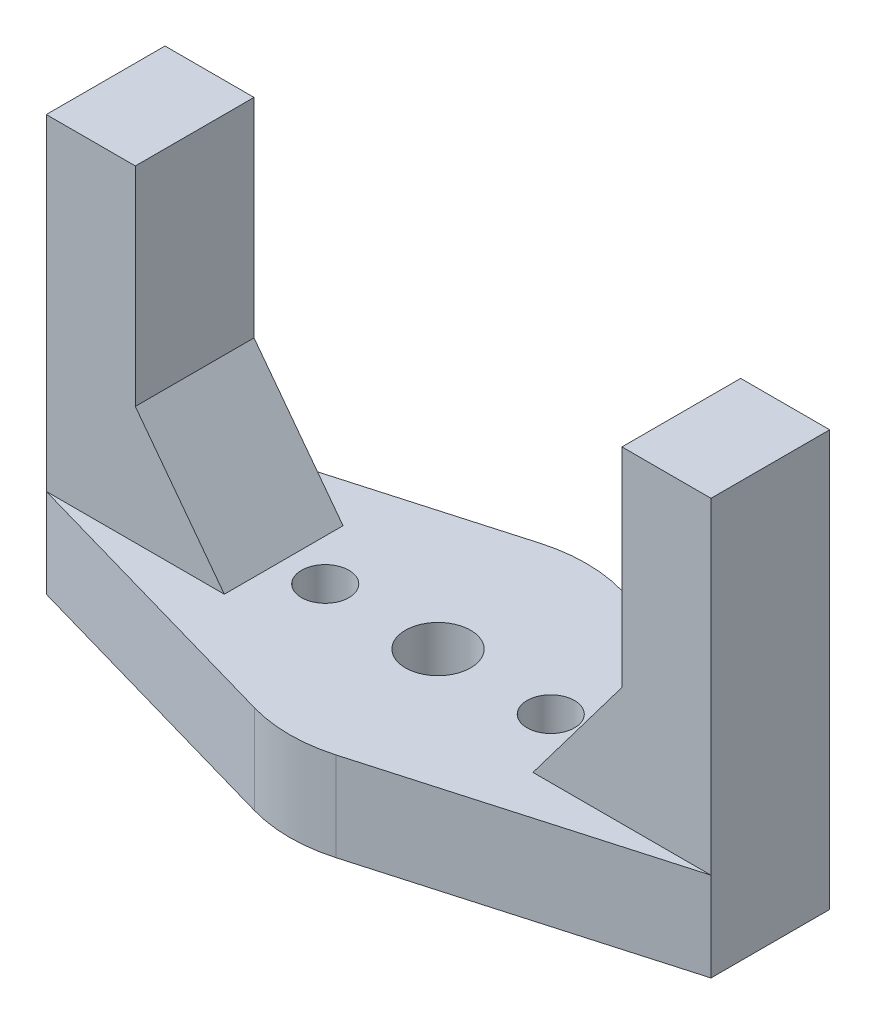
ISO-10303-21;
HEADER;
FILE_DESCRIPTION(('STEP AP214'),'2;1');
FILE_NAME('part.step','',(''),(''),'','','');
FILE_SCHEMA(('AUTOMOTIVE_DESIGN { 1 0 10303 214 1 1 1 1 }'));
ENDSEC;
DATA;
#1=APPLICATION_CONTEXT('core data for automotive mechanical design processes');
#2=APPLICATION_PROTOCOL_DEFINITION('international standard','automotive_design',2000,#1);
#3=PRODUCT_CONTEXT('',#1,'mechanical');
#4=PRODUCT('Part','Part','',(#3));
#5=PRODUCT_RELATED_PRODUCT_CATEGORY('part','',(#4));
#6=PRODUCT_DEFINITION_FORMATION('','',#4);
#7=PRODUCT_DEFINITION_CONTEXT('part definition',#1,'design');
#8=PRODUCT_DEFINITION('design','',#6,#7);
#9=PRODUCT_DEFINITION_SHAPE('','',#8);
#10=(LENGTH_UNIT() NAMED_UNIT(*) SI_UNIT(.MILLI.,.METRE.));
#11=(NAMED_UNIT(*) PLANE_ANGLE_UNIT() SI_UNIT($,.RADIAN.));
#12=(NAMED_UNIT(*) SI_UNIT($,.STERADIAN.) SOLID_ANGLE_UNIT());
#13=UNCERTAINTY_MEASURE_WITH_UNIT(LENGTH_MEASURE(1.E-05),#10,'distance_accuracy_value','');
#14=(GEOMETRIC_REPRESENTATION_CONTEXT(3) GLOBAL_UNCERTAINTY_ASSIGNED_CONTEXT((#13)) GLOBAL_UNIT_ASSIGNED_CONTEXT((#10,
#11,#12)) REPRESENTATION_CONTEXT('',''));
#15=CARTESIAN_POINT('',(0.,0.,0.));
#16=DIRECTION('',(0.,0.,1.));
#17=DIRECTION('',(1.,0.,0.));
#18=AXIS2_PLACEMENT_3D('',#15,#16,#17);
#19=CARTESIAN_POINT('',(0.,15.,0.));
#20=DIRECTION('',(0.,1.,0.));
#21=DIRECTION('',(0.,0.,1.));
#22=AXIS2_PLACEMENT_3D('',#19,#20,#21);
#23=PLANE('',#22);
#24=CARTESIAN_POINT('',(0.,15.,0.));
#25=DIRECTION('',(0.,1.,0.));
#26=DIRECTION('',(0.,0.,1.));
#27=AXIS2_PLACEMENT_3D('',#24,#25,#26);
#28=CIRCLE('',#27,5.5);
#29=CARTESIAN_POINT('',(0.,15.,5.5));
#30=VERTEX_POINT('',#29);
#31=EDGE_CURVE('E364',#30,#30,#28,.T.);
#32=ORIENTED_EDGE('',*,*,#31,.F.);
#33=EDGE_LOOP('',(#32));
#34=FACE_BOUND('',#33,.T.);
#35=CARTESIAN_POINT('',(19.,15.,0.));
#36=DIRECTION('',(0.,1.,0.));
#37=DIRECTION('',(0.,0.,1.));
#38=AXIS2_PLACEMENT_3D('',#35,#36,#37);
#39=CIRCLE('',#38,4.);
#40=CARTESIAN_POINT('',(19.,15.,3.99999999999999));
#41=VERTEX_POINT('',#40);
#42=EDGE_CURVE('E357',#41,#41,#39,.T.);
#43=ORIENTED_EDGE('',*,*,#42,.F.);
#44=EDGE_LOOP('',(#43));
#45=FACE_BOUND('',#44,.T.);
#46=CARTESIAN_POINT('',(-19.,15.,0.));
#47=DIRECTION('',(0.,1.,0.));
#48=DIRECTION('',(0.,0.,1.));
#49=AXIS2_PLACEMENT_3D('',#46,#47,#48);
#50=CIRCLE('',#49,4.);
#51=CARTESIAN_POINT('',(-19.,15.,4.));
#52=VERTEX_POINT('',#51);
#53=EDGE_CURVE('E353',#52,#52,#50,.T.);
#54=ORIENTED_EDGE('',*,*,#53,.F.);
#55=EDGE_LOOP('',(#54));
#56=FACE_BOUND('',#55,.T.);
#57=DIRECTION('',(-1.,0.,0.));
#58=VECTOR('',#57,1.);
#59=CARTESIAN_POINT('',(56.,15.,10.));
#60=LINE('',#59,#58);
#61=CARTESIAN_POINT('',(56.,15.,10.));
#62=VERTEX_POINT('',#61);
#63=CARTESIAN_POINT('',(26.0000000000001,15.,10.));
#64=VERTEX_POINT('',#63);
#65=EDGE_CURVE('E399',#62,#64,#60,.T.);
#66=ORIENTED_EDGE('',*,*,#65,.T.);
#67=DIRECTION('',(0.,0.,-1.));
#68=VECTOR('',#67,1.);
#69=CARTESIAN_POINT('',(26.0000000000001,15.,-10.));
#70=LINE('',#69,#68);
#71=CARTESIAN_POINT('',(26.0000000000001,15.,-10.));
#72=VERTEX_POINT('',#71);
#73=EDGE_CURVE('E410',#64,#72,#70,.T.);
#74=ORIENTED_EDGE('',*,*,#73,.T.);
#75=DIRECTION('',(1.,0.,0.));
#76=VECTOR('',#75,1.);
#77=CARTESIAN_POINT('',(56.,15.,-10.));
#78=LINE('',#77,#76);
#79=CARTESIAN_POINT('',(56.,15.,-10.));
#80=VERTEX_POINT('',#79);
#81=EDGE_CURVE('E282',#72,#80,#78,.T.);
#82=ORIENTED_EDGE('',*,*,#81,.T.);
#83=DIRECTION('',(0.961521918786539,0.,0.27472822878811));
#84=VECTOR('',#83,1.);
#85=CARTESIAN_POINT('',(6.86820571970274,15.,-24.0380479696634));
#86=LINE('',#85,#84);
#87=CARTESIAN_POINT('',(6.8682057197028,15.,-24.0380479696634));
#88=VERTEX_POINT('',#87);
#89=EDGE_CURVE('E271',#88,#80,#86,.T.);
#90=ORIENTED_EDGE('',*,*,#89,.F.);
#91=CARTESIAN_POINT('',(0.,15.,0.));
#92=DIRECTION('',(0.,1.,0.));
#93=DIRECTION('',(0.,0.,1.));
#94=AXIS2_PLACEMENT_3D('',#91,#92,#93);
#95=CIRCLE('',#94,25.);
#96=CARTESIAN_POINT('',(-6.86820571970296,15.,-24.0380479696634));
#97=VERTEX_POINT('',#96);
#98=EDGE_CURVE('E390',#88,#97,#95,.T.);
#99=ORIENTED_EDGE('',*,*,#98,.T.);
#100=DIRECTION('',(-0.961521918786537,0.,0.274728228788119));
#101=VECTOR('',#100,1.);
#102=CARTESIAN_POINT('',(-6.86820571970297,15.,-24.0380479696634));
#103=LINE('',#102,#101);
#104=CARTESIAN_POINT('',(-56.,15.,-10.));
#105=VERTEX_POINT('',#104);
#106=EDGE_CURVE('E395',#97,#105,#103,.T.);
#107=ORIENTED_EDGE('',*,*,#106,.T.);
#108=DIRECTION('',(1.,0.,0.));
#109=VECTOR('',#108,1.);
#110=CARTESIAN_POINT('',(-56.,15.,-10.));
#111=LINE('',#110,#109);
#112=CARTESIAN_POINT('',(-26.0000000000001,15.,-10.));
#113=VERTEX_POINT('',#112);
#114=EDGE_CURVE('E427',#105,#113,#111,.T.);
#115=ORIENTED_EDGE('',*,*,#114,.T.);
#116=DIRECTION('',(0.,0.,1.));
#117=VECTOR('',#116,1.);
#118=CARTESIAN_POINT('',(-26.0000000000001,15.,10.));
#119=LINE('',#118,#117);
#120=CARTESIAN_POINT('',(-26.0000000000001,15.,10.));
#121=VERTEX_POINT('',#120);
#122=EDGE_CURVE('E406',#113,#121,#119,.T.);
#123=ORIENTED_EDGE('',*,*,#122,.T.);
#124=DIRECTION('',(-1.,0.,0.));
#125=VECTOR('',#124,1.);
#126=CARTESIAN_POINT('',(-56.,15.,10.));
#127=LINE('',#126,#125);
#128=CARTESIAN_POINT('',(-56.,15.,10.));
#129=VERTEX_POINT('',#128);
#130=EDGE_CURVE('E381',#121,#129,#127,.T.);
#131=ORIENTED_EDGE('',*,*,#130,.T.);
#132=DIRECTION('',(-0.961521918786537,0.,-0.274728228788119));
#133=VECTOR('',#132,1.);
#134=CARTESIAN_POINT('',(-6.86820571970297,15.,24.0380479696634));
#135=LINE('',#134,#133);
#136=CARTESIAN_POINT('',(-6.86820571970296,15.,24.0380479696634));
#137=VERTEX_POINT('',#136);
#138=EDGE_CURVE('E452',#137,#129,#135,.T.);
#139=ORIENTED_EDGE('',*,*,#138,.F.);
#140=CARTESIAN_POINT('',(0.,15.,0.));
#141=DIRECTION('',(0.,1.,0.));
#142=DIRECTION('',(0.,0.,1.));
#143=AXIS2_PLACEMENT_3D('',#140,#141,#142);
#144=CIRCLE('',#143,25.);
#145=CARTESIAN_POINT('',(6.8682057197028,15.,24.0380479696634));
#146=VERTEX_POINT('',#145);
#147=EDGE_CURVE('E391',#137,#146,#144,.T.);
#148=ORIENTED_EDGE('',*,*,#147,.T.);
#149=DIRECTION('',(0.961521918786539,0.,-0.27472822878811));
#150=VECTOR('',#149,1.);
#151=CARTESIAN_POINT('',(6.86820571970274,15.,24.0380479696634));
#152=LINE('',#151,#150);
#153=EDGE_CURVE('E464',#146,#62,#152,.T.);
#154=ORIENTED_EDGE('',*,*,#153,.T.);
#155=EDGE_LOOP('',(#66,#74,#82,#90,#99,#107,#115,#123,#131,#139,#148,#154));
#156=FACE_BOUND('',#155,.T.);
#157=ADVANCED_FACE('F143',(#34,#45,#56,#156),#23,.T.);
#158=CARTESIAN_POINT('',(0.,0.,0.));
#159=DIRECTION('',(0.,1.,0.));
#160=DIRECTION('',(0.,0.,1.));
#161=AXIS2_PLACEMENT_3D('',#158,#159,#160);
#162=PLANE('',#161);
#163=DIRECTION('',(0.,0.,1.));
#164=VECTOR('',#163,1.);
#165=CARTESIAN_POINT('',(56.,0.,-10.));
#166=LINE('',#165,#164);
#167=CARTESIAN_POINT('',(56.,0.,-10.));
#168=VERTEX_POINT('',#167);
#169=CARTESIAN_POINT('',(56.,0.,10.));
#170=VERTEX_POINT('',#169);
#171=EDGE_CURVE('E263',#168,#170,#166,.T.);
#172=ORIENTED_EDGE('',*,*,#171,.T.);
#173=DIRECTION('',(0.961521918786539,0.,-0.27472822878811));
#174=VECTOR('',#173,1.);
#175=CARTESIAN_POINT('',(6.86820571970274,0.,24.0380479696634));
#176=LINE('',#175,#174);
#177=CARTESIAN_POINT('',(6.86820571970277,0.,24.0380479696634));
#178=VERTEX_POINT('',#177);
#179=EDGE_CURVE('E459',#178,#170,#176,.T.);
#180=ORIENTED_EDGE('',*,*,#179,.F.);
#181=CARTESIAN_POINT('',(0.,0.,0.));
#182=DIRECTION('',(0.,-1.,0.));
#183=DIRECTION('',(0.,0.,-1.));
#184=AXIS2_PLACEMENT_3D('',#181,#182,#183);
#185=CIRCLE('',#184,25.);
#186=CARTESIAN_POINT('',(-6.86820571970296,0.,24.0380479696634));
#187=VERTEX_POINT('',#186);
#188=EDGE_CURVE('E392',#178,#187,#185,.T.);
#189=ORIENTED_EDGE('',*,*,#188,.T.);
#190=DIRECTION('',(-0.961521918786537,0.,-0.274728228788119));
#191=VECTOR('',#190,1.);
#192=CARTESIAN_POINT('',(-6.86820571970297,0.,24.0380479696634));
#193=LINE('',#192,#191);
#194=CARTESIAN_POINT('',(-56.,0.,10.));
#195=VERTEX_POINT('',#194);
#196=EDGE_CURVE('E449',#187,#195,#193,.T.);
#197=ORIENTED_EDGE('',*,*,#196,.T.);
#198=DIRECTION('',(0.,0.,-1.));
#199=VECTOR('',#198,1.);
#200=CARTESIAN_POINT('',(-56.,0.,-10.));
#201=LINE('',#200,#199);
#202=CARTESIAN_POINT('',(-56.,0.,-10.));
#203=VERTEX_POINT('',#202);
#204=EDGE_CURVE('E290',#195,#203,#201,.T.);
#205=ORIENTED_EDGE('',*,*,#204,.T.);
#206=DIRECTION('',(-0.961521918786537,0.,0.274728228788119));
#207=VECTOR('',#206,1.);
#208=CARTESIAN_POINT('',(-6.86820571970297,0.,-24.0380479696634));
#209=LINE('',#208,#207);
#210=CARTESIAN_POINT('',(-6.86820571970296,0.,-24.0380479696634));
#211=VERTEX_POINT('',#210);
#212=EDGE_CURVE('E467',#211,#203,#209,.T.);
#213=ORIENTED_EDGE('',*,*,#212,.F.);
#214=CARTESIAN_POINT('',(0.,0.,0.));
#215=DIRECTION('',(0.,-1.,0.));
#216=DIRECTION('',(0.,0.,-1.));
#217=AXIS2_PLACEMENT_3D('',#214,#215,#216);
#218=CIRCLE('',#217,25.);
#219=CARTESIAN_POINT('',(6.86820571970277,0.,-24.0380479696634));
#220=VERTEX_POINT('',#219);
#221=EDGE_CURVE('E266',#211,#220,#218,.T.);
#222=ORIENTED_EDGE('',*,*,#221,.T.);
#223=DIRECTION('',(0.961521918786539,0.,0.27472822878811));
#224=VECTOR('',#223,1.);
#225=CARTESIAN_POINT('',(6.86820571970274,0.,-24.0380479696634));
#226=LINE('',#225,#224);
#227=EDGE_CURVE('E257',#220,#168,#226,.T.);
#228=ORIENTED_EDGE('',*,*,#227,.T.);
#229=EDGE_LOOP('',(#172,#180,#189,#197,#205,#213,#222,#228));
#230=FACE_BOUND('',#229,.T.);
#231=CARTESIAN_POINT('',(0.,0.,0.));
#232=DIRECTION('',(0.,1.,0.));
#233=DIRECTION('',(0.,0.,1.));
#234=AXIS2_PLACEMENT_3D('',#231,#232,#233);
#235=CIRCLE('',#234,5.5);
#236=CARTESIAN_POINT('',(0.,0.,5.5));
#237=VERTEX_POINT('',#236);
#238=EDGE_CURVE('E369',#237,#237,#235,.T.);
#239=ORIENTED_EDGE('',*,*,#238,.T.);
#240=EDGE_LOOP('',(#239));
#241=FACE_BOUND('',#240,.T.);
#242=CARTESIAN_POINT('',(19.,0.,0.));
#243=DIRECTION('',(0.,1.,0.));
#244=DIRECTION('',(0.,0.,-1.));
#245=AXIS2_PLACEMENT_3D('',#242,#243,#244);
#246=CIRCLE('',#245,1.8);
#247=CARTESIAN_POINT('',(19.,0.,-1.80000000000001));
#248=VERTEX_POINT('',#247);
#249=EDGE_CURVE('E368',#248,#248,#246,.T.);
#250=ORIENTED_EDGE('',*,*,#249,.T.);
#251=EDGE_LOOP('',(#250));
#252=FACE_BOUND('',#251,.T.);
#253=CARTESIAN_POINT('',(-19.,0.,0.));
#254=DIRECTION('',(0.,1.,0.));
#255=DIRECTION('',(0.,0.,1.));
#256=AXIS2_PLACEMENT_3D('',#253,#254,#255);
#257=CIRCLE('',#256,1.8);
#258=CARTESIAN_POINT('',(-19.,0.,1.8));
#259=VERTEX_POINT('',#258);
#260=EDGE_CURVE('E377',#259,#259,#257,.T.);
#261=ORIENTED_EDGE('',*,*,#260,.T.);
#262=EDGE_LOOP('',(#261));
#263=FACE_BOUND('',#262,.T.);
#264=ADVANCED_FACE('F259',(#230,#241,#252,#263),#162,.F.);
#265=CARTESIAN_POINT('',(-19.,15.,0.));
#266=DIRECTION('',(0.,-1.,0.));
#267=DIRECTION('',(0.,0.,-1.));
#268=AXIS2_PLACEMENT_3D('',#265,#266,#267);
#269=CYLINDRICAL_SURFACE('',#268,1.8);
#270=ORIENTED_EDGE('',*,*,#260,.F.);
#271=EDGE_LOOP('',(#270));
#272=FACE_BOUND('',#271,.T.);
#273=CARTESIAN_POINT('',(-19.,7.,0.));
#274=DIRECTION('',(0.,1.,0.));
#275=DIRECTION('',(0.,0.,1.));
#276=AXIS2_PLACEMENT_3D('',#273,#274,#275);
#277=CIRCLE('',#276,1.8);
#278=CARTESIAN_POINT('',(-19.,7.,1.8));
#279=VERTEX_POINT('',#278);
#280=EDGE_CURVE('E373',#279,#279,#277,.T.);
#281=ORIENTED_EDGE('',*,*,#280,.T.);
#282=EDGE_LOOP('',(#281));
#283=FACE_BOUND('',#282,.T.);
#284=ADVANCED_FACE('F540',(#272,#283),#269,.F.);
#285=CARTESIAN_POINT('',(19.,15.,0.));
#286=DIRECTION('',(0.,-1.,0.));
#287=DIRECTION('',(0.,0.,-1.));
#288=AXIS2_PLACEMENT_3D('',#285,#286,#287);
#289=CYLINDRICAL_SURFACE('',#288,1.8);
#290=ORIENTED_EDGE('',*,*,#249,.F.);
#291=EDGE_LOOP('',(#290));
#292=FACE_BOUND('',#291,.T.);
#293=CARTESIAN_POINT('',(19.,7.,0.));
#294=DIRECTION('',(0.,1.,0.));
#295=DIRECTION('',(0.,0.,1.));
#296=AXIS2_PLACEMENT_3D('',#293,#294,#295);
#297=CIRCLE('',#296,1.8);
#298=CARTESIAN_POINT('',(19.,7.,1.8));
#299=VERTEX_POINT('',#298);
#300=EDGE_CURVE('E352',#299,#299,#297,.T.);
#301=ORIENTED_EDGE('',*,*,#300,.T.);
#302=EDGE_LOOP('',(#301));
#303=FACE_BOUND('',#302,.T.);
#304=ADVANCED_FACE('F612',(#292,#303),#289,.F.);
#305=CARTESIAN_POINT('',(0.,15.,0.));
#306=DIRECTION('',(0.,-1.,0.));
#307=DIRECTION('',(0.,0.,-1.));
#308=AXIS2_PLACEMENT_3D('',#305,#306,#307);
#309=CYLINDRICAL_SURFACE('',#308,5.5);
#310=ORIENTED_EDGE('',*,*,#31,.T.);
#311=EDGE_LOOP('',(#310));
#312=FACE_BOUND('',#311,.T.);
#313=ORIENTED_EDGE('',*,*,#238,.F.);
#314=EDGE_LOOP('',(#313));
#315=FACE_BOUND('',#314,.T.);
#316=ADVANCED_FACE('F606',(#312,#315),#309,.F.);
#317=CARTESIAN_POINT('',(19.,7.,0.));
#318=DIRECTION('',(0.,1.,0.));
#319=DIRECTION('',(0.,0.,1.));
#320=AXIS2_PLACEMENT_3D('',#317,#318,#319);
#321=CYLINDRICAL_SURFACE('',#320,4.);
#322=CARTESIAN_POINT('',(19.,7.,0.));
#323=DIRECTION('',(0.,1.,0.));
#324=DIRECTION('',(0.,0.,1.));
#325=AXIS2_PLACEMENT_3D('',#322,#323,#324);
#326=CIRCLE('',#325,4.);
#327=CARTESIAN_POINT('',(19.,7.,3.99999999999999));
#328=VERTEX_POINT('',#327);
#329=EDGE_CURVE('E337',#328,#328,#326,.T.);
#330=ORIENTED_EDGE('',*,*,#329,.F.);
#331=EDGE_LOOP('',(#330));
#332=FACE_BOUND('',#331,.T.);
#333=ORIENTED_EDGE('',*,*,#42,.T.);
#334=EDGE_LOOP('',(#333));
#335=FACE_BOUND('',#334,.T.);
#336=ADVANCED_FACE('F603',(#332,#335),#321,.F.);
#337=CARTESIAN_POINT('',(19.,7.,0.));
#338=DIRECTION('',(0.,1.,0.));
#339=DIRECTION('',(0.,0.,1.));
#340=AXIS2_PLACEMENT_3D('',#337,#338,#339);
#341=PLANE('',#340);
#342=ORIENTED_EDGE('',*,*,#300,.F.);
#343=EDGE_LOOP('',(#342));
#344=FACE_BOUND('',#343,.T.);
#345=ORIENTED_EDGE('',*,*,#329,.T.);
#346=EDGE_LOOP('',(#345));
#347=FACE_BOUND('',#346,.T.);
#348=ADVANCED_FACE('F601',(#344,#347),#341,.T.);
#349=CARTESIAN_POINT('',(-19.,7.,0.));
#350=DIRECTION('',(0.,1.,0.));
#351=DIRECTION('',(0.,0.,1.));
#352=AXIS2_PLACEMENT_3D('',#349,#350,#351);
#353=CYLINDRICAL_SURFACE('',#352,4.);
#354=CARTESIAN_POINT('',(-19.,7.,0.));
#355=DIRECTION('',(0.,1.,0.));
#356=DIRECTION('',(0.,0.,1.));
#357=AXIS2_PLACEMENT_3D('',#354,#355,#356);
#358=CIRCLE('',#357,4.);
#359=CARTESIAN_POINT('',(-19.,7.,4.));
#360=VERTEX_POINT('',#359);
#361=EDGE_CURVE('E348',#360,#360,#358,.T.);
#362=ORIENTED_EDGE('',*,*,#361,.F.);
#363=EDGE_LOOP('',(#362));
#364=FACE_BOUND('',#363,.T.);
#365=ORIENTED_EDGE('',*,*,#53,.T.);
#366=EDGE_LOOP('',(#365));
#367=FACE_BOUND('',#366,.T.);
#368=ADVANCED_FACE('F597',(#364,#367),#353,.F.);
#369=CARTESIAN_POINT('',(-19.,7.,0.));
#370=DIRECTION('',(0.,1.,0.));
#371=DIRECTION('',(0.,0.,1.));
#372=AXIS2_PLACEMENT_3D('',#369,#370,#371);
#373=PLANE('',#372);
#374=ORIENTED_EDGE('',*,*,#280,.F.);
#375=EDGE_LOOP('',(#374));
#376=FACE_BOUND('',#375,.T.);
#377=ORIENTED_EDGE('',*,*,#361,.T.);
#378=EDGE_LOOP('',(#377));
#379=FACE_BOUND('',#378,.T.);
#380=ADVANCED_FACE('F594',(#376,#379),#373,.T.);
#381=CARTESIAN_POINT('',(-41.,70.,-10.));
#382=DIRECTION('',(1.,0.,0.));
#383=DIRECTION('',(0.,0.,-1.));
#384=AXIS2_PLACEMENT_3D('',#381,#382,#383);
#385=PLANE('',#384);
#386=DIRECTION('',(0.,-1.,0.));
#387=VECTOR('',#386,1.);
#388=CARTESIAN_POINT('',(-41.,70.,10.));
#389=LINE('',#388,#387);
#390=CARTESIAN_POINT('',(-41.,70.,10.));
#391=VERTEX_POINT('',#390);
#392=CARTESIAN_POINT('',(-41.,34.9056723243063,10.));
#393=VERTEX_POINT('',#392);
#394=EDGE_CURVE('E331',#391,#393,#389,.T.);
#395=ORIENTED_EDGE('',*,*,#394,.T.);
#396=DIRECTION('',(0.,0.,-1.));
#397=VECTOR('',#396,1.);
#398=CARTESIAN_POINT('',(-41.,34.9056723243063,-10.));
#399=LINE('',#398,#397);
#400=CARTESIAN_POINT('',(-41.,34.9056723243063,-10.));
#401=VERTEX_POINT('',#400);
#402=EDGE_CURVE('E414',#393,#401,#399,.T.);
#403=ORIENTED_EDGE('',*,*,#402,.T.);
#404=DIRECTION('',(0.,-1.,0.));
#405=VECTOR('',#404,1.);
#406=CARTESIAN_POINT('',(-41.,70.,-10.));
#407=LINE('',#406,#405);
#408=CARTESIAN_POINT('',(-41.,70.,-10.));
#409=VERTEX_POINT('',#408);
#410=EDGE_CURVE('E333',#409,#401,#407,.T.);
#411=ORIENTED_EDGE('',*,*,#410,.F.);
#412=DIRECTION('',(0.,0.,1.));
#413=VECTOR('',#412,1.);
#414=CARTESIAN_POINT('',(-41.,70.,-10.));
#415=LINE('',#414,#413);
#416=EDGE_CURVE('E296',#409,#391,#415,.T.);
#417=ORIENTED_EDGE('',*,*,#416,.T.);
#418=EDGE_LOOP('',(#395,#403,#411,#417));
#419=FACE_BOUND('',#418,.T.);
#420=ADVANCED_FACE('F591',(#419),#385,.T.);
#421=CARTESIAN_POINT('',(-56.,70.,-10.));
#422=DIRECTION('',(0.,0.,-1.));
#423=DIRECTION('',(-1.,0.,0.));
#424=AXIS2_PLACEMENT_3D('',#421,#422,#423);
#425=PLANE('',#424);
#426=ORIENTED_EDGE('',*,*,#114,.F.);
#427=DIRECTION('',(0.,-1.,0.));
#428=VECTOR('',#427,1.);
#429=CARTESIAN_POINT('',(-56.,70.,-10.));
#430=LINE('',#429,#428);
#431=CARTESIAN_POINT('',(-56.,70.,-10.));
#432=VERTEX_POINT('',#431);
#433=EDGE_CURVE('E338',#432,#105,#430,.T.);
#434=ORIENTED_EDGE('',*,*,#433,.F.);
#435=DIRECTION('',(1.,0.,0.));
#436=VECTOR('',#435,1.);
#437=CARTESIAN_POINT('',(-56.,70.,-10.));
#438=LINE('',#437,#436);
#439=EDGE_CURVE('E328',#432,#409,#438,.T.);
#440=ORIENTED_EDGE('',*,*,#439,.T.);
#441=ORIENTED_EDGE('',*,*,#410,.T.);
#442=DIRECTION('',(-0.601815023152044,0.798635510047296,0.));
#443=VECTOR('',#442,1.);
#444=CARTESIAN_POINT('',(-41.,34.9056723243063,-10.));
#445=LINE('',#444,#443);
#446=EDGE_CURVE('E153',#401,#113,#445,.F.);
#447=ORIENTED_EDGE('',*,*,#446,.T.);
#448=EDGE_LOOP('',(#426,#434,#440,#441,#447));
#449=FACE_BOUND('',#448,.T.);
#450=ADVANCED_FACE('F426',(#449),#425,.T.);
#451=CARTESIAN_POINT('',(-56.,70.,-10.));
#452=DIRECTION('',(-1.,0.,0.));
#453=DIRECTION('',(0.,0.,1.));
#454=AXIS2_PLACEMENT_3D('',#451,#452,#453);
#455=PLANE('',#454);
#456=ORIENTED_EDGE('',*,*,#433,.T.);
#457=DIRECTION('',(0.,-1.,0.));
#458=VECTOR('',#457,1.);
#459=CARTESIAN_POINT('',(-56.,47.2698035979862,-10.));
#460=LINE('',#459,#458);
#461=EDGE_CURVE('E434',#105,#203,#460,.T.);
#462=ORIENTED_EDGE('',*,*,#461,.T.);
#463=ORIENTED_EDGE('',*,*,#204,.F.);
#464=DIRECTION('',(0.,-1.,0.));
#465=VECTOR('',#464,1.);
#466=CARTESIAN_POINT('',(-56.,47.2698035979862,10.));
#467=LINE('',#466,#465);
#468=EDGE_CURVE('E440',#129,#195,#467,.T.);
#469=ORIENTED_EDGE('',*,*,#468,.F.);
#470=DIRECTION('',(0.,-1.,0.));
#471=VECTOR('',#470,1.);
#472=CARTESIAN_POINT('',(-56.,70.,10.));
#473=LINE('',#472,#471);
#474=CARTESIAN_POINT('',(-56.,70.,10.));
#475=VERTEX_POINT('',#474);
#476=EDGE_CURVE('E342',#475,#129,#473,.T.);
#477=ORIENTED_EDGE('',*,*,#476,.F.);
#478=DIRECTION('',(0.,0.,-1.));
#479=VECTOR('',#478,1.);
#480=CARTESIAN_POINT('',(-56.,70.,-10.));
#481=LINE('',#480,#479);
#482=EDGE_CURVE('E324',#475,#432,#481,.T.);
#483=ORIENTED_EDGE('',*,*,#482,.T.);
#484=EDGE_LOOP('',(#456,#462,#463,#469,#477,#483));
#485=FACE_BOUND('',#484,.T.);
#486=ADVANCED_FACE('F514',(#485),#455,.T.);
#487=CARTESIAN_POINT('',(-56.,70.,10.));
#488=DIRECTION('',(0.,0.,1.));
#489=DIRECTION('',(1.,0.,0.));
#490=AXIS2_PLACEMENT_3D('',#487,#488,#489);
#491=PLANE('',#490);
#492=ORIENTED_EDGE('',*,*,#130,.F.);
#493=DIRECTION('',(0.601815023152044,-0.798635510047296,0.));
#494=VECTOR('',#493,1.);
#495=CARTESIAN_POINT('',(-41.,34.9056723243063,10.));
#496=LINE('',#495,#494);
#497=EDGE_CURVE('E12',#121,#393,#496,.F.);
#498=ORIENTED_EDGE('',*,*,#497,.T.);
#499=ORIENTED_EDGE('',*,*,#394,.F.);
#500=DIRECTION('',(-1.,0.,0.));
#501=VECTOR('',#500,1.);
#502=CARTESIAN_POINT('',(-56.,70.,10.));
#503=LINE('',#502,#501);
#504=EDGE_CURVE('E320',#391,#475,#503,.T.);
#505=ORIENTED_EDGE('',*,*,#504,.T.);
#506=ORIENTED_EDGE('',*,*,#476,.T.);
#507=EDGE_LOOP('',(#492,#498,#499,#505,#506));
#508=FACE_BOUND('',#507,.T.);
#509=ADVANCED_FACE('F577',(#508),#491,.T.);
#510=CARTESIAN_POINT('',(0.,70.,0.));
#511=DIRECTION('',(0.,1.,0.));
#512=DIRECTION('',(0.,0.,1.));
#513=AXIS2_PLACEMENT_3D('',#510,#511,#512);
#514=PLANE('',#513);
#515=ORIENTED_EDGE('',*,*,#416,.F.);
#516=ORIENTED_EDGE('',*,*,#439,.F.);
#517=ORIENTED_EDGE('',*,*,#482,.F.);
#518=ORIENTED_EDGE('',*,*,#504,.F.);
#519=EDGE_LOOP('',(#515,#516,#517,#518));
#520=FACE_BOUND('',#519,.T.);
#521=ADVANCED_FACE('F572',(#520),#514,.T.);
#522=CARTESIAN_POINT('',(56.,70.,-10.));
#523=DIRECTION('',(1.,0.,0.));
#524=DIRECTION('',(0.,0.,-1.));
#525=AXIS2_PLACEMENT_3D('',#522,#523,#524);
#526=PLANE('',#525);
#527=DIRECTION('',(0.,-1.,0.));
#528=VECTOR('',#527,1.);
#529=CARTESIAN_POINT('',(56.,70.,10.));
#530=LINE('',#529,#528);
#531=CARTESIAN_POINT('',(56.,70.,10.));
#532=VERTEX_POINT('',#531);
#533=EDGE_CURVE('E310',#532,#62,#530,.T.);
#534=ORIENTED_EDGE('',*,*,#533,.T.);
#535=DIRECTION('',(0.,-1.,0.));
#536=VECTOR('',#535,1.);
#537=CARTESIAN_POINT('',(56.,47.2698035979862,10.));
#538=LINE('',#537,#536);
#539=EDGE_CURVE('E283',#62,#170,#538,.T.);
#540=ORIENTED_EDGE('',*,*,#539,.T.);
#541=ORIENTED_EDGE('',*,*,#171,.F.);
#542=DIRECTION('',(0.,-1.,0.));
#543=VECTOR('',#542,1.);
#544=CARTESIAN_POINT('',(56.,47.2698035979862,-10.));
#545=LINE('',#544,#543);
#546=EDGE_CURVE('E275',#80,#168,#545,.T.);
#547=ORIENTED_EDGE('',*,*,#546,.F.);
#548=DIRECTION('',(0.,-1.,0.));
#549=VECTOR('',#548,1.);
#550=CARTESIAN_POINT('',(56.,70.,-10.));
#551=LINE('',#550,#549);
#552=CARTESIAN_POINT('',(56.,70.,-10.));
#553=VERTEX_POINT('',#552);
#554=EDGE_CURVE('E303',#553,#80,#551,.T.);
#555=ORIENTED_EDGE('',*,*,#554,.F.);
#556=DIRECTION('',(0.,0.,1.));
#557=VECTOR('',#556,1.);
#558=CARTESIAN_POINT('',(56.,70.,-10.));
#559=LINE('',#558,#557);
#560=EDGE_CURVE('E291',#553,#532,#559,.T.);
#561=ORIENTED_EDGE('',*,*,#560,.T.);
#562=EDGE_LOOP('',(#534,#540,#541,#547,#555,#561));
#563=FACE_BOUND('',#562,.T.);
#564=ADVANCED_FACE('F287',(#563),#526,.T.);
#565=CARTESIAN_POINT('',(56.,70.,-10.));
#566=DIRECTION('',(0.,0.,-1.));
#567=DIRECTION('',(-1.,0.,0.));
#568=AXIS2_PLACEMENT_3D('',#565,#566,#567);
#569=PLANE('',#568);
#570=ORIENTED_EDGE('',*,*,#81,.F.);
#571=DIRECTION('',(-0.601815023152044,-0.798635510047296,0.));
#572=VECTOR('',#571,1.);
#573=CARTESIAN_POINT('',(41.,34.9056723243063,-10.));
#574=LINE('',#573,#572);
#575=CARTESIAN_POINT('',(41.,34.9056723243063,-10.));
#576=VERTEX_POINT('',#575);
#577=EDGE_CURVE('E421',#72,#576,#574,.F.);
#578=ORIENTED_EDGE('',*,*,#577,.T.);
#579=DIRECTION('',(0.,-1.,0.));
#580=VECTOR('',#579,1.);
#581=CARTESIAN_POINT('',(41.,70.,-10.));
#582=LINE('',#581,#580);
#583=CARTESIAN_POINT('',(41.,70.,-10.));
#584=VERTEX_POINT('',#583);
#585=EDGE_CURVE('E482',#584,#576,#582,.T.);
#586=ORIENTED_EDGE('',*,*,#585,.F.);
#587=DIRECTION('',(1.,0.,0.));
#588=VECTOR('',#587,1.);
#589=CARTESIAN_POINT('',(56.,70.,-10.));
#590=LINE('',#589,#588);
#591=EDGE_CURVE('E305',#584,#553,#590,.T.);
#592=ORIENTED_EDGE('',*,*,#591,.T.);
#593=ORIENTED_EDGE('',*,*,#554,.T.);
#594=EDGE_LOOP('',(#570,#578,#586,#592,#593));
#595=FACE_BOUND('',#594,.T.);
#596=ADVANCED_FACE('F489',(#595),#569,.T.);
#597=CARTESIAN_POINT('',(41.,70.,-10.));
#598=DIRECTION('',(-1.,0.,0.));
#599=DIRECTION('',(0.,0.,1.));
#600=AXIS2_PLACEMENT_3D('',#597,#598,#599);
#601=PLANE('',#600);
#602=ORIENTED_EDGE('',*,*,#585,.T.);
#603=DIRECTION('',(0.,0.,1.));
#604=VECTOR('',#603,1.);
#605=CARTESIAN_POINT('',(41.,34.9056723243063,10.));
#606=LINE('',#605,#604);
#607=CARTESIAN_POINT('',(41.,34.9056723243063,10.));
#608=VERTEX_POINT('',#607);
#609=EDGE_CURVE('E402',#576,#608,#606,.T.);
#610=ORIENTED_EDGE('',*,*,#609,.T.);
#611=DIRECTION('',(0.,-1.,0.));
#612=VECTOR('',#611,1.);
#613=CARTESIAN_POINT('',(41.,70.,10.));
#614=LINE('',#613,#612);
#615=CARTESIAN_POINT('',(41.,70.,10.));
#616=VERTEX_POINT('',#615);
#617=EDGE_CURVE('E479',#616,#608,#614,.T.);
#618=ORIENTED_EDGE('',*,*,#617,.F.);
#619=DIRECTION('',(0.,0.,-1.));
#620=VECTOR('',#619,1.);
#621=CARTESIAN_POINT('',(41.,70.,-10.));
#622=LINE('',#621,#620);
#623=EDGE_CURVE('E309',#616,#584,#622,.T.);
#624=ORIENTED_EDGE('',*,*,#623,.T.);
#625=EDGE_LOOP('',(#602,#610,#618,#624));
#626=FACE_BOUND('',#625,.T.);
#627=ADVANCED_FACE('F523',(#626),#601,.T.);
#628=CARTESIAN_POINT('',(56.,70.,10.));
#629=DIRECTION('',(0.,0.,1.));
#630=DIRECTION('',(1.,0.,0.));
#631=AXIS2_PLACEMENT_3D('',#628,#629,#630);
#632=PLANE('',#631);
#633=ORIENTED_EDGE('',*,*,#65,.F.);
#634=ORIENTED_EDGE('',*,*,#533,.F.);
#635=DIRECTION('',(-1.,0.,0.));
#636=VECTOR('',#635,1.);
#637=CARTESIAN_POINT('',(56.,70.,10.));
#638=LINE('',#637,#636);
#639=EDGE_CURVE('E299',#532,#616,#638,.T.);
#640=ORIENTED_EDGE('',*,*,#639,.T.);
#641=ORIENTED_EDGE('',*,*,#617,.T.);
#642=DIRECTION('',(0.601815023152044,0.798635510047296,0.));
#643=VECTOR('',#642,1.);
#644=CARTESIAN_POINT('',(41.,34.9056723243063,10.));
#645=LINE('',#644,#643);
#646=EDGE_CURVE('E417',#608,#64,#645,.F.);
#647=ORIENTED_EDGE('',*,*,#646,.T.);
#648=EDGE_LOOP('',(#633,#634,#640,#641,#647));
#649=FACE_BOUND('',#648,.T.);
#650=ADVANCED_FACE('F498',(#649),#632,.T.);
#651=CARTESIAN_POINT('',(0.,70.,0.));
#652=DIRECTION('',(0.,-1.,0.));
#653=DIRECTION('',(0.,0.,-1.));
#654=AXIS2_PLACEMENT_3D('',#651,#652,#653);
#655=PLANE('',#654);
#656=ORIENTED_EDGE('',*,*,#560,.F.);
#657=ORIENTED_EDGE('',*,*,#591,.F.);
#658=ORIENTED_EDGE('',*,*,#623,.F.);
#659=ORIENTED_EDGE('',*,*,#639,.F.);
#660=EDGE_LOOP('',(#656,#657,#658,#659));
#661=FACE_BOUND('',#660,.T.);
#662=ADVANCED_FACE('F494',(#661),#655,.F.);
#663=CARTESIAN_POINT('',(0.,70.,0.));
#664=DIRECTION('',(0.,-1.,0.));
#665=DIRECTION('',(0.,0.,-1.));
#666=AXIS2_PLACEMENT_3D('',#663,#664,#665);
#667=CYLINDRICAL_SURFACE('',#666,25.);
#668=ORIENTED_EDGE('',*,*,#98,.F.);
#669=DIRECTION('',(0.,-1.,0.));
#670=VECTOR('',#669,1.);
#671=CARTESIAN_POINT('',(6.8682057197028,70.,-24.0380479696634));
#672=LINE('',#671,#670);
#673=EDGE_CURVE('E433',#88,#220,#672,.T.);
#674=ORIENTED_EDGE('',*,*,#673,.T.);
#675=ORIENTED_EDGE('',*,*,#221,.F.);
#676=DIRECTION('',(0.,-1.,0.));
#677=VECTOR('',#676,1.);
#678=CARTESIAN_POINT('',(-6.86820571970296,70.,-24.0380479696634));
#679=LINE('',#678,#677);
#680=EDGE_CURVE('E456',#97,#211,#679,.T.);
#681=ORIENTED_EDGE('',*,*,#680,.F.);
#682=EDGE_LOOP('',(#668,#674,#675,#681));
#683=FACE_BOUND('',#682,.T.);
#684=ADVANCED_FACE('F559',(#683),#667,.T.);
#685=CARTESIAN_POINT('',(-6.86820571970297,70.,-24.0380479696634));
#686=DIRECTION('',(-0.274728228788119,0.,-0.961521918786536));
#687=DIRECTION('',(-0.961521918786537,0.,0.274728228788119));
#688=AXIS2_PLACEMENT_3D('',#685,#686,#687);
#689=PLANE('',#688);
#690=ORIENTED_EDGE('',*,*,#680,.T.);
#691=ORIENTED_EDGE('',*,*,#212,.T.);
#692=ORIENTED_EDGE('',*,*,#461,.F.);
#693=ORIENTED_EDGE('',*,*,#106,.F.);
#694=EDGE_LOOP('',(#690,#691,#692,#693));
#695=FACE_BOUND('',#694,.T.);
#696=ADVANCED_FACE('F562',(#695),#689,.T.);
#697=CARTESIAN_POINT('',(0.,70.,0.));
#698=DIRECTION('',(0.,-1.,0.));
#699=DIRECTION('',(0.,0.,-1.));
#700=AXIS2_PLACEMENT_3D('',#697,#698,#699);
#701=CYLINDRICAL_SURFACE('',#700,25.);
#702=ORIENTED_EDGE('',*,*,#147,.F.);
#703=DIRECTION('',(0.,-1.,0.));
#704=VECTOR('',#703,1.);
#705=CARTESIAN_POINT('',(-6.86820571970296,70.,24.0380479696634));
#706=LINE('',#705,#704);
#707=EDGE_CURVE('E272',#137,#187,#706,.T.);
#708=ORIENTED_EDGE('',*,*,#707,.T.);
#709=ORIENTED_EDGE('',*,*,#188,.F.);
#710=DIRECTION('',(0.,-1.,0.));
#711=VECTOR('',#710,1.);
#712=CARTESIAN_POINT('',(6.8682057197028,70.,24.0380479696634));
#713=LINE('',#712,#711);
#714=EDGE_CURVE('E455',#146,#178,#713,.T.);
#715=ORIENTED_EDGE('',*,*,#714,.F.);
#716=EDGE_LOOP('',(#702,#708,#709,#715));
#717=FACE_BOUND('',#716,.T.);
#718=ADVANCED_FACE('F518',(#717),#701,.T.);
#719=CARTESIAN_POINT('',(6.86820571970274,70.,24.0380479696634));
#720=DIRECTION('',(0.27472822878811,0.,0.961521918786539));
#721=DIRECTION('',(0.961521918786539,0.,-0.27472822878811));
#722=AXIS2_PLACEMENT_3D('',#719,#720,#721);
#723=PLANE('',#722);
#724=ORIENTED_EDGE('',*,*,#714,.T.);
#725=ORIENTED_EDGE('',*,*,#179,.T.);
#726=ORIENTED_EDGE('',*,*,#539,.F.);
#727=ORIENTED_EDGE('',*,*,#153,.F.);
#728=EDGE_LOOP('',(#724,#725,#726,#727));
#729=FACE_BOUND('',#728,.T.);
#730=ADVANCED_FACE('F500',(#729),#723,.T.);
#731=CARTESIAN_POINT('',(-6.86820571970297,70.,24.0380479696634));
#732=DIRECTION('',(0.274728228788119,0.,-0.961521918786536));
#733=DIRECTION('',(-0.961521918786537,0.,-0.274728228788119));
#734=AXIS2_PLACEMENT_3D('',#731,#732,#733);
#735=PLANE('',#734);
#736=ORIENTED_EDGE('',*,*,#138,.T.);
#737=ORIENTED_EDGE('',*,*,#468,.T.);
#738=ORIENTED_EDGE('',*,*,#196,.F.);
#739=ORIENTED_EDGE('',*,*,#707,.F.);
#740=EDGE_LOOP('',(#736,#737,#738,#739));
#741=FACE_BOUND('',#740,.T.);
#742=ADVANCED_FACE('F511',(#741),#735,.F.);
#743=CARTESIAN_POINT('',(6.86820571970274,70.,-24.0380479696634));
#744=DIRECTION('',(-0.27472822878811,0.,0.961521918786539));
#745=DIRECTION('',(0.961521918786539,0.,0.27472822878811));
#746=AXIS2_PLACEMENT_3D('',#743,#744,#745);
#747=PLANE('',#746);
#748=ORIENTED_EDGE('',*,*,#89,.T.);
#749=ORIENTED_EDGE('',*,*,#546,.T.);
#750=ORIENTED_EDGE('',*,*,#227,.F.);
#751=ORIENTED_EDGE('',*,*,#673,.F.);
#752=EDGE_LOOP('',(#748,#749,#750,#751));
#753=FACE_BOUND('',#752,.T.);
#754=ADVANCED_FACE('F276',(#753),#747,.F.);
#755=CARTESIAN_POINT('',(41.,34.9056723243063,-10.));
#756=DIRECTION('',(-0.798635510047296,0.601815023152044,0.));
#757=DIRECTION('',(0.,0.,-1.));
#758=AXIS2_PLACEMENT_3D('',#755,#756,#757);
#759=PLANE('',#758);
#760=ORIENTED_EDGE('',*,*,#577,.F.);
#761=ORIENTED_EDGE('',*,*,#73,.F.);
#762=ORIENTED_EDGE('',*,*,#646,.F.);
#763=ORIENTED_EDGE('',*,*,#609,.F.);
#764=EDGE_LOOP('',(#760,#761,#762,#763));
#765=FACE_BOUND('',#764,.T.);
#766=ADVANCED_FACE('F522',(#765),#759,.T.);
#767=CARTESIAN_POINT('',(-41.,34.9056723243063,-10.));
#768=DIRECTION('',(0.798635510047296,0.601815023152044,0.));
#769=DIRECTION('',(0.,0.,1.));
#770=AXIS2_PLACEMENT_3D('',#767,#768,#769);
#771=PLANE('',#770);
#772=ORIENTED_EDGE('',*,*,#497,.F.);
#773=ORIENTED_EDGE('',*,*,#122,.F.);
#774=ORIENTED_EDGE('',*,*,#446,.F.);
#775=ORIENTED_EDGE('',*,*,#402,.F.);
#776=EDGE_LOOP('',(#772,#773,#774,#775));
#777=FACE_BOUND('',#776,.T.);
#778=ADVANCED_FACE('F146',(#777),#771,.T.);
#779=CLOSED_SHELL('',(#157,#264,#284,#304,#316,#336,#348,#368,#380,#420,#450,#486,#509,#521,
#564,#596,#627,#650,#662,#684,#696,#718,#730,#742,#754,#766,#778));
#780=MANIFOLD_SOLID_BREP('B2',#779);
#781=ADVANCED_BREP_SHAPE_REPRESENTATION('',(#18,#780),#14);
#782=SHAPE_DEFINITION_REPRESENTATION(#9,#781);
ENDSEC;
END-ISO-10303-21;
